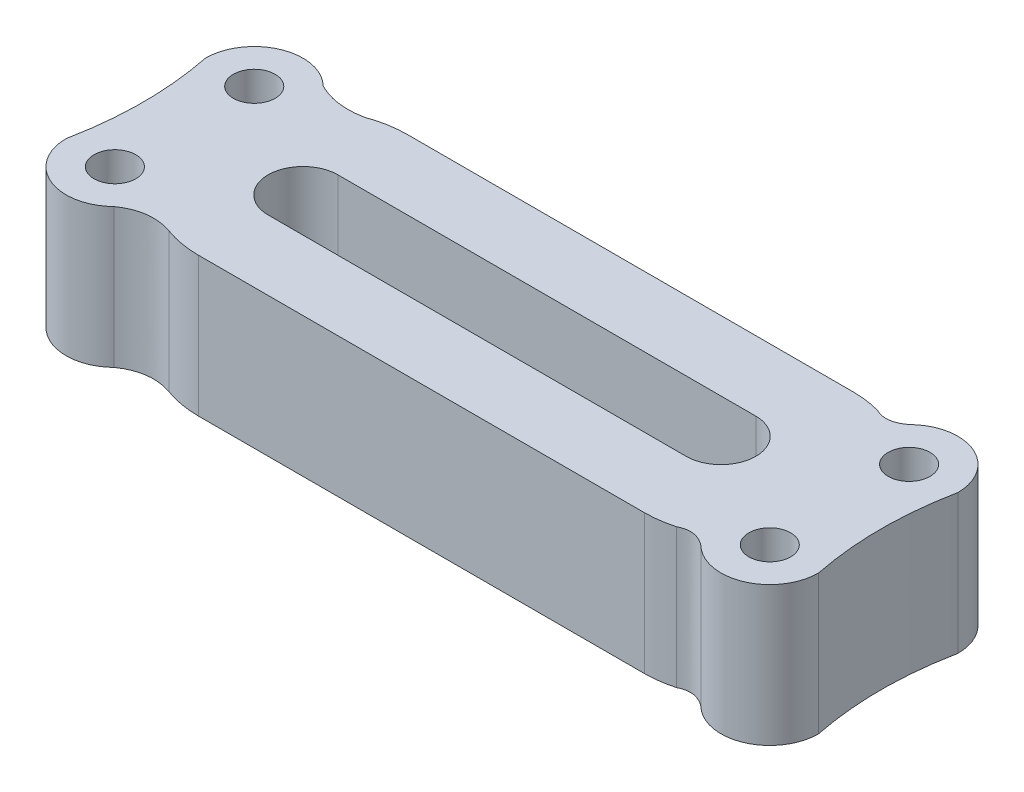
ISO-10303-21;
HEADER;
FILE_DESCRIPTION(('STEP AP214'),'2;1');
FILE_NAME('part.step','',(''),(''),'','','');
FILE_SCHEMA(('AUTOMOTIVE_DESIGN { 1 0 10303 214 1 1 1 1 }'));
ENDSEC;
DATA;
#1=APPLICATION_CONTEXT('core data for automotive mechanical design processes');
#2=APPLICATION_PROTOCOL_DEFINITION('international standard','automotive_design',2000,#1);
#3=PRODUCT_CONTEXT('',#1,'mechanical');
#4=PRODUCT('Part','Part','',(#3));
#5=PRODUCT_RELATED_PRODUCT_CATEGORY('part','',(#4));
#6=PRODUCT_DEFINITION_FORMATION('','',#4);
#7=PRODUCT_DEFINITION_CONTEXT('part definition',#1,'design');
#8=PRODUCT_DEFINITION('design','',#6,#7);
#9=PRODUCT_DEFINITION_SHAPE('','',#8);
#10=(LENGTH_UNIT() NAMED_UNIT(*) SI_UNIT(.MILLI.,.METRE.));
#11=(NAMED_UNIT(*) PLANE_ANGLE_UNIT() SI_UNIT($,.RADIAN.));
#12=(NAMED_UNIT(*) SI_UNIT($,.STERADIAN.) SOLID_ANGLE_UNIT());
#13=UNCERTAINTY_MEASURE_WITH_UNIT(LENGTH_MEASURE(1.E-05),#10,'distance_accuracy_value','');
#14=(GEOMETRIC_REPRESENTATION_CONTEXT(3) GLOBAL_UNCERTAINTY_ASSIGNED_CONTEXT((#13)) GLOBAL_UNIT_ASSIGNED_CONTEXT((#10,
#11,#12)) REPRESENTATION_CONTEXT('',''));
#15=CARTESIAN_POINT('',(0.,0.,0.));
#16=DIRECTION('',(0.,0.,1.));
#17=DIRECTION('',(1.,0.,0.));
#18=AXIS2_PLACEMENT_3D('',#15,#16,#17);
#19=CARTESIAN_POINT('',(-15.,10.,-2.5));
#20=DIRECTION('',(0.,1.,0.));
#21=DIRECTION('',(0.,0.,1.));
#22=AXIS2_PLACEMENT_3D('',#19,#20,#21);
#23=PLANE('',#22);
#24=CARTESIAN_POINT('',(23.5,10.,-7.5));
#25=DIRECTION('',(0.,1.,0.));
#26=DIRECTION('',(0.,0.,1.));
#27=AXIS2_PLACEMENT_3D('',#24,#25,#26);
#28=CIRCLE('',#27,1.5);
#29=CARTESIAN_POINT('',(23.5,10.,-6.));
#30=VERTEX_POINT('',#29);
#31=EDGE_CURVE('E870',#30,#30,#28,.T.);
#32=ORIENTED_EDGE('',*,*,#31,.F.);
#33=EDGE_LOOP('',(#32));
#34=FACE_BOUND('',#33,.T.);
#35=CARTESIAN_POINT('',(-23.5,10.,2.5));
#36=DIRECTION('',(0.,1.,0.));
#37=DIRECTION('',(0.,0.,1.));
#38=AXIS2_PLACEMENT_3D('',#35,#36,#37);
#39=CIRCLE('',#38,1.5);
#40=CARTESIAN_POINT('',(-23.5,10.,4.));
#41=VERTEX_POINT('',#40);
#42=EDGE_CURVE('E222',#41,#41,#39,.T.);
#43=ORIENTED_EDGE('',*,*,#42,.F.);
#44=EDGE_LOOP('',(#43));
#45=FACE_BOUND('',#44,.T.);
#46=CARTESIAN_POINT('',(-15.,10.,-2.5));
#47=DIRECTION('',(0.,1.,0.));
#48=DIRECTION('',(0.,0.,1.));
#49=AXIS2_PLACEMENT_3D('',#46,#47,#48);
#50=CIRCLE('',#49,7.5);
#51=CARTESIAN_POINT('',(-17.5874091079145,10.,4.53955354467036));
#52=VERTEX_POINT('',#51);
#53=CARTESIAN_POINT('',(-15.,10.,5.));
#54=VERTEX_POINT('',#53);
#55=EDGE_CURVE('E238',#52,#54,#50,.T.);
#56=ORIENTED_EDGE('',*,*,#55,.T.);
#57=DIRECTION('',(1.,0.,0.));
#58=VECTOR('',#57,1.);
#59=CARTESIAN_POINT('',(-15.,10.,5.));
#60=LINE('',#59,#58);
#61=CARTESIAN_POINT('',(17.,10.,5.));
#62=VERTEX_POINT('',#61);
#63=EDGE_CURVE('E242',#54,#62,#60,.T.);
#64=ORIENTED_EDGE('',*,*,#63,.T.);
#65=CARTESIAN_POINT('',(17.,10.,-2.5));
#66=DIRECTION('',(0.,1.,0.));
#67=DIRECTION('',(0.,0.,-1.));
#68=AXIS2_PLACEMENT_3D('',#65,#66,#67);
#69=CIRCLE('',#68,7.5);
#70=CARTESIAN_POINT('',(19.0308614368456,10.,4.7198062179212));
#71=VERTEX_POINT('',#70);
#72=EDGE_CURVE('E246',#62,#71,#69,.T.);
#73=ORIENTED_EDGE('',*,*,#72,.T.);
#74=CARTESIAN_POINT('',(19.0308614368456,10.,4.7198062179212));
#75=CARTESIAN_POINT('',(20.0349832779337,10.,4.21106423664924));
#76=CARTESIAN_POINT('',(21.0505102572168,10.,4.99999999999999));
#77=B_SPLINE_CURVE_WITH_KNOTS('',2,(#74,#75,#76),.UNSPECIFIED.,.F.,.F.,(3,3),(0.,1.),.UNSPECIFIED.);
#78=CARTESIAN_POINT('',(21.0505102572168,10.,4.99999999999999));
#79=VERTEX_POINT('',#78);
#80=EDGE_CURVE('E249',#71,#79,#77,.T.);
#81=ORIENTED_EDGE('',*,*,#80,.T.);
#82=CARTESIAN_POINT('',(23.5,10.,2.5));
#83=DIRECTION('',(0.,1.,0.));
#84=DIRECTION('',(0.,0.,1.));
#85=AXIS2_PLACEMENT_3D('',#82,#83,#84);
#86=CIRCLE('',#85,3.5);
#87=CARTESIAN_POINT('',(27.,10.,2.5));
#88=VERTEX_POINT('',#87);
#89=EDGE_CURVE('E255',#79,#88,#86,.T.);
#90=ORIENTED_EDGE('',*,*,#89,.T.);
#91=CARTESIAN_POINT('',(27.,10.,2.5));
#92=CARTESIAN_POINT('',(26.,10.,-2.5));
#93=CARTESIAN_POINT('',(27.,10.,-7.5));
#94=B_SPLINE_CURVE_WITH_KNOTS('',2,(#91,#92,#93),.UNSPECIFIED.,.F.,.F.,(3,3),(0.,1.),.UNSPECIFIED.);
#95=CARTESIAN_POINT('',(27.,10.,-7.5));
#96=VERTEX_POINT('',#95);
#97=EDGE_CURVE('E462',#88,#96,#94,.T.);
#98=ORIENTED_EDGE('',*,*,#97,.T.);
#99=CARTESIAN_POINT('',(23.5,10.,-7.5));
#100=DIRECTION('',(0.,1.,0.));
#101=DIRECTION('',(0.,0.,1.));
#102=AXIS2_PLACEMENT_3D('',#99,#100,#101);
#103=CIRCLE('',#102,3.5);
#104=CARTESIAN_POINT('',(21.0505102572168,10.,-10.));
#105=VERTEX_POINT('',#104);
#106=EDGE_CURVE('E464',#96,#105,#103,.T.);
#107=ORIENTED_EDGE('',*,*,#106,.T.);
#108=CARTESIAN_POINT('',(21.0505102572168,10.,-10.));
#109=CARTESIAN_POINT('',(20.0349832779337,10.,-9.21106423664925));
#110=CARTESIAN_POINT('',(19.0308614368456,10.,-9.71980621792119));
#111=B_SPLINE_CURVE_WITH_KNOTS('',2,(#108,#109,#110),.UNSPECIFIED.,.F.,.F.,(3,3),(0.,1.),.UNSPECIFIED.);
#112=CARTESIAN_POINT('',(19.0308614368456,10.,-9.71980621792119));
#113=VERTEX_POINT('',#112);
#114=EDGE_CURVE('E467',#105,#113,#111,.T.);
#115=ORIENTED_EDGE('',*,*,#114,.T.);
#116=CARTESIAN_POINT('',(17.,10.,-2.5));
#117=DIRECTION('',(0.,1.,0.));
#118=DIRECTION('',(0.,0.,-1.));
#119=AXIS2_PLACEMENT_3D('',#116,#117,#118);
#120=CIRCLE('',#119,7.5);
#121=CARTESIAN_POINT('',(17.,10.,-9.99999999999999));
#122=VERTEX_POINT('',#121);
#123=EDGE_CURVE('E495',#113,#122,#120,.T.);
#124=ORIENTED_EDGE('',*,*,#123,.T.);
#125=DIRECTION('',(-1.,0.,0.));
#126=VECTOR('',#125,1.);
#127=CARTESIAN_POINT('',(-15.,10.,-9.99999999999999));
#128=LINE('',#127,#126);
#129=CARTESIAN_POINT('',(-15.,10.,-9.99999999999999));
#130=VERTEX_POINT('',#129);
#131=EDGE_CURVE('E501',#122,#130,#128,.T.);
#132=ORIENTED_EDGE('',*,*,#131,.T.);
#133=CARTESIAN_POINT('',(-15.,10.,-2.5));
#134=DIRECTION('',(0.,1.,0.));
#135=DIRECTION('',(0.,0.,1.));
#136=AXIS2_PLACEMENT_3D('',#133,#134,#135);
#137=CIRCLE('',#136,7.5);
#138=CARTESIAN_POINT('',(-17.5874091079145,10.,-9.53955354467035));
#139=VERTEX_POINT('',#138);
#140=EDGE_CURVE('E504',#130,#139,#137,.T.);
#141=ORIENTED_EDGE('',*,*,#140,.T.);
#142=CARTESIAN_POINT('',(-17.5874091079145,10.,-9.53955354467035));
#143=CARTESIAN_POINT('',(-19.4284579155136,10.,-9.15641368122657));
#144=CARTESIAN_POINT('',(-21.0505102572168,10.,-10.));
#145=B_SPLINE_CURVE_WITH_KNOTS('',2,(#142,#143,#144),.UNSPECIFIED.,.F.,.F.,(3,3),(0.,1.),.UNSPECIFIED.);
#146=CARTESIAN_POINT('',(-21.0505102572168,10.,-10.));
#147=VERTEX_POINT('',#146);
#148=EDGE_CURVE('E507',#139,#147,#145,.T.);
#149=ORIENTED_EDGE('',*,*,#148,.T.);
#150=CARTESIAN_POINT('',(-23.5,10.,-7.5));
#151=DIRECTION('',(0.,1.,0.));
#152=DIRECTION('',(0.,0.,1.));
#153=AXIS2_PLACEMENT_3D('',#150,#151,#152);
#154=CIRCLE('',#153,3.5);
#155=CARTESIAN_POINT('',(-27.,10.,-7.5));
#156=VERTEX_POINT('',#155);
#157=EDGE_CURVE('E513',#147,#156,#154,.T.);
#158=ORIENTED_EDGE('',*,*,#157,.T.);
#159=CARTESIAN_POINT('',(-27.,10.,-7.5));
#160=CARTESIAN_POINT('',(-26.,10.,-2.5));
#161=CARTESIAN_POINT('',(-27.,10.,2.5));
#162=B_SPLINE_CURVE_WITH_KNOTS('',2,(#159,#160,#161),.UNSPECIFIED.,.F.,.F.,(3,3),(0.,1.),.UNSPECIFIED.);
#163=CARTESIAN_POINT('',(-27.,10.,2.5));
#164=VERTEX_POINT('',#163);
#165=EDGE_CURVE('E552',#156,#164,#162,.T.);
#166=ORIENTED_EDGE('',*,*,#165,.T.);
#167=CARTESIAN_POINT('',(-23.5,10.,2.5));
#168=DIRECTION('',(0.,1.,0.));
#169=DIRECTION('',(0.,0.,1.));
#170=AXIS2_PLACEMENT_3D('',#167,#168,#169);
#171=CIRCLE('',#170,3.5);
#172=CARTESIAN_POINT('',(-21.0505102572168,10.,5.));
#173=VERTEX_POINT('',#172);
#174=EDGE_CURVE('E307',#164,#173,#171,.T.);
#175=ORIENTED_EDGE('',*,*,#174,.T.);
#176=CARTESIAN_POINT('',(-21.0505102572168,10.,5.));
#177=CARTESIAN_POINT('',(-19.4864809640116,10.,3.90383801335037));
#178=CARTESIAN_POINT('',(-17.5874091079145,10.,4.53955354467036));
#179=B_SPLINE_CURVE_WITH_KNOTS('',2,(#176,#177,#178),.UNSPECIFIED.,.F.,.F.,(3,3),(0.,1.),.UNSPECIFIED.);
#180=EDGE_CURVE('E299',#173,#52,#179,.T.);
#181=ORIENTED_EDGE('',*,*,#180,.T.);
#182=EDGE_LOOP('',(#56,#64,#73,#81,#90,#98,#107,#115,#124,#132,#141,#149,#158,#166,#175,#181));
#183=FACE_BOUND('',#182,.T.);
#184=DIRECTION('',(-1.,0.,0.));
#185=VECTOR('',#184,1.);
#186=CARTESIAN_POINT('',(-15.,10.,-4.99999999999999));
#187=LINE('',#186,#185);
#188=CARTESIAN_POINT('',(15.,10.,-4.99999999999999));
#189=VERTEX_POINT('',#188);
#190=CARTESIAN_POINT('',(-15.,10.,-4.99999999999999));
#191=VERTEX_POINT('',#190);
#192=EDGE_CURVE('E196',#189,#191,#187,.T.);
#193=ORIENTED_EDGE('',*,*,#192,.F.);
#194=CARTESIAN_POINT('',(15.,10.,-2.5));
#195=DIRECTION('',(0.,1.,0.));
#196=DIRECTION('',(0.,0.,-1.));
#197=AXIS2_PLACEMENT_3D('',#194,#195,#196);
#198=CIRCLE('',#197,2.5);
#199=CARTESIAN_POINT('',(15.,10.,0.));
#200=VERTEX_POINT('',#199);
#201=EDGE_CURVE('E187',#200,#189,#198,.T.);
#202=ORIENTED_EDGE('',*,*,#201,.F.);
#203=DIRECTION('',(1.,0.,0.));
#204=VECTOR('',#203,1.);
#205=CARTESIAN_POINT('',(-15.,10.,0.));
#206=LINE('',#205,#204);
#207=CARTESIAN_POINT('',(-15.,10.,0.));
#208=VERTEX_POINT('',#207);
#209=EDGE_CURVE('E214',#208,#200,#206,.T.);
#210=ORIENTED_EDGE('',*,*,#209,.F.);
#211=CARTESIAN_POINT('',(-15.,10.,-2.5));
#212=DIRECTION('',(0.,1.,0.));
#213=DIRECTION('',(0.,0.,1.));
#214=AXIS2_PLACEMENT_3D('',#211,#212,#213);
#215=CIRCLE('',#214,2.5);
#216=EDGE_CURVE('E210',#191,#208,#215,.T.);
#217=ORIENTED_EDGE('',*,*,#216,.F.);
#218=EDGE_LOOP('',(#193,#202,#210,#217));
#219=FACE_BOUND('',#218,.T.);
#220=CARTESIAN_POINT('',(-23.5,10.,-7.5));
#221=DIRECTION('',(0.,1.,0.));
#222=DIRECTION('',(0.,0.,1.));
#223=AXIS2_PLACEMENT_3D('',#220,#221,#222);
#224=CIRCLE('',#223,1.5);
#225=CARTESIAN_POINT('',(-23.5,10.,-6.));
#226=VERTEX_POINT('',#225);
#227=EDGE_CURVE('E878',#226,#226,#224,.T.);
#228=ORIENTED_EDGE('',*,*,#227,.F.);
#229=EDGE_LOOP('',(#228));
#230=FACE_BOUND('',#229,.T.);
#231=CARTESIAN_POINT('',(23.5,10.,2.5));
#232=DIRECTION('',(0.,1.,0.));
#233=DIRECTION('',(0.,0.,1.));
#234=AXIS2_PLACEMENT_3D('',#231,#232,#233);
#235=CIRCLE('',#234,1.5);
#236=CARTESIAN_POINT('',(23.5,10.,4.));
#237=VERTEX_POINT('',#236);
#238=EDGE_CURVE('E859',#237,#237,#235,.T.);
#239=ORIENTED_EDGE('',*,*,#238,.F.);
#240=EDGE_LOOP('',(#239));
#241=FACE_BOUND('',#240,.T.);
#242=ADVANCED_FACE('F49',(#34,#45,#183,#219,#230,#241),#23,.T.);
#243=CARTESIAN_POINT('',(-15.,0.,-2.5));
#244=DIRECTION('',(0.,1.,0.));
#245=DIRECTION('',(0.,0.,1.));
#246=AXIS2_PLACEMENT_3D('',#243,#244,#245);
#247=PLANE('',#246);
#248=CARTESIAN_POINT('',(-15.,0.,-2.5));
#249=DIRECTION('',(0.,1.,0.));
#250=DIRECTION('',(0.,0.,1.));
#251=AXIS2_PLACEMENT_3D('',#248,#249,#250);
#252=CIRCLE('',#251,7.5);
#253=CARTESIAN_POINT('',(-17.5874091079145,0.,4.53955354467036));
#254=VERTEX_POINT('',#253);
#255=CARTESIAN_POINT('',(-15.,0.,5.));
#256=VERTEX_POINT('',#255);
#257=EDGE_CURVE('E205',#254,#256,#252,.T.);
#258=ORIENTED_EDGE('',*,*,#257,.F.);
#259=CARTESIAN_POINT('',(-21.0505102572168,0.,5.));
#260=CARTESIAN_POINT('',(-19.4864809640116,0.,3.90383801335037));
#261=CARTESIAN_POINT('',(-17.5874091079145,0.,4.53955354467036));
#262=B_SPLINE_CURVE_WITH_KNOTS('',2,(#259,#260,#261),.UNSPECIFIED.,.F.,.F.,(3,3),(0.,1.),.UNSPECIFIED.);
#263=CARTESIAN_POINT('',(-21.0505102572168,0.,5.));
#264=VERTEX_POINT('',#263);
#265=EDGE_CURVE('E243',#264,#254,#262,.T.);
#266=ORIENTED_EDGE('',*,*,#265,.F.);
#267=CARTESIAN_POINT('',(-23.5,0.,2.5));
#268=DIRECTION('',(0.,1.,0.));
#269=DIRECTION('',(0.,0.,1.));
#270=AXIS2_PLACEMENT_3D('',#267,#268,#269);
#271=CIRCLE('',#270,3.5);
#272=CARTESIAN_POINT('',(-27.,0.,2.5));
#273=VERTEX_POINT('',#272);
#274=EDGE_CURVE('E376',#273,#264,#271,.T.);
#275=ORIENTED_EDGE('',*,*,#274,.F.);
#276=CARTESIAN_POINT('',(-27.,0.,-7.5));
#277=CARTESIAN_POINT('',(-26.,0.,-2.5));
#278=CARTESIAN_POINT('',(-27.,0.,2.5));
#279=B_SPLINE_CURVE_WITH_KNOTS('',2,(#276,#277,#278),.UNSPECIFIED.,.F.,.F.,(3,3),(0.,1.),.UNSPECIFIED.);
#280=CARTESIAN_POINT('',(-27.,0.,-7.5));
#281=VERTEX_POINT('',#280);
#282=EDGE_CURVE('E371',#281,#273,#279,.T.);
#283=ORIENTED_EDGE('',*,*,#282,.F.);
#284=CARTESIAN_POINT('',(-23.5,0.,-7.5));
#285=DIRECTION('',(0.,1.,0.));
#286=DIRECTION('',(0.,0.,1.));
#287=AXIS2_PLACEMENT_3D('',#284,#285,#286);
#288=CIRCLE('',#287,3.5);
#289=CARTESIAN_POINT('',(-21.0505102572168,0.,-10.));
#290=VERTEX_POINT('',#289);
#291=EDGE_CURVE('E365',#290,#281,#288,.T.);
#292=ORIENTED_EDGE('',*,*,#291,.F.);
#293=CARTESIAN_POINT('',(-17.5874091079145,0.,-9.53955354467035));
#294=CARTESIAN_POINT('',(-19.4284579155136,0.,-9.15641368122657));
#295=CARTESIAN_POINT('',(-21.0505102572168,0.,-10.));
#296=B_SPLINE_CURVE_WITH_KNOTS('',2,(#293,#294,#295),.UNSPECIFIED.,.F.,.F.,(3,3),(0.,1.),.UNSPECIFIED.);
#297=CARTESIAN_POINT('',(-17.5874091079145,0.,-9.53955354467035));
#298=VERTEX_POINT('',#297);
#299=EDGE_CURVE('E360',#298,#290,#296,.T.);
#300=ORIENTED_EDGE('',*,*,#299,.F.);
#301=CARTESIAN_POINT('',(-15.,0.,-2.5));
#302=DIRECTION('',(0.,1.,0.));
#303=DIRECTION('',(0.,0.,1.));
#304=AXIS2_PLACEMENT_3D('',#301,#302,#303);
#305=CIRCLE('',#304,7.5);
#306=CARTESIAN_POINT('',(-15.,0.,-9.99999999999999));
#307=VERTEX_POINT('',#306);
#308=EDGE_CURVE('E357',#307,#298,#305,.T.);
#309=ORIENTED_EDGE('',*,*,#308,.F.);
#310=DIRECTION('',(-1.,0.,0.));
#311=VECTOR('',#310,1.);
#312=CARTESIAN_POINT('',(-15.,0.,-9.99999999999999));
#313=LINE('',#312,#311);
#314=CARTESIAN_POINT('',(17.,0.,-9.99999999999999));
#315=VERTEX_POINT('',#314);
#316=EDGE_CURVE('E354',#315,#307,#313,.T.);
#317=ORIENTED_EDGE('',*,*,#316,.F.);
#318=CARTESIAN_POINT('',(17.,0.,-2.5));
#319=DIRECTION('',(0.,1.,0.));
#320=DIRECTION('',(0.,0.,-1.));
#321=AXIS2_PLACEMENT_3D('',#318,#319,#320);
#322=CIRCLE('',#321,7.5);
#323=CARTESIAN_POINT('',(19.0308614368456,0.,-9.71980621792119));
#324=VERTEX_POINT('',#323);
#325=EDGE_CURVE('E348',#324,#315,#322,.T.);
#326=ORIENTED_EDGE('',*,*,#325,.F.);
#327=CARTESIAN_POINT('',(21.0505102572168,0.,-10.));
#328=CARTESIAN_POINT('',(20.0349832779337,0.,-9.21106423664925));
#329=CARTESIAN_POINT('',(19.0308614368456,0.,-9.71980621792119));
#330=B_SPLINE_CURVE_WITH_KNOTS('',2,(#327,#328,#329),.UNSPECIFIED.,.F.,.F.,(3,3),(0.,1.),.UNSPECIFIED.);
#331=CARTESIAN_POINT('',(21.0505102572168,0.,-10.));
#332=VERTEX_POINT('',#331);
#333=EDGE_CURVE('E343',#332,#324,#330,.T.);
#334=ORIENTED_EDGE('',*,*,#333,.F.);
#335=CARTESIAN_POINT('',(23.5,0.,-7.5));
#336=DIRECTION('',(0.,1.,0.));
#337=DIRECTION('',(0.,0.,1.));
#338=AXIS2_PLACEMENT_3D('',#335,#336,#337);
#339=CIRCLE('',#338,3.5);
#340=CARTESIAN_POINT('',(27.,0.,-7.5));
#341=VERTEX_POINT('',#340);
#342=EDGE_CURVE('E337',#341,#332,#339,.T.);
#343=ORIENTED_EDGE('',*,*,#342,.F.);
#344=CARTESIAN_POINT('',(27.,0.,2.5));
#345=CARTESIAN_POINT('',(26.,0.,-2.5));
#346=CARTESIAN_POINT('',(27.,0.,-7.5));
#347=B_SPLINE_CURVE_WITH_KNOTS('',2,(#344,#345,#346),.UNSPECIFIED.,.F.,.F.,(3,3),(0.,1.),.UNSPECIFIED.);
#348=CARTESIAN_POINT('',(27.,0.,2.5));
#349=VERTEX_POINT('',#348);
#350=EDGE_CURVE('E332',#349,#341,#347,.T.);
#351=ORIENTED_EDGE('',*,*,#350,.F.);
#352=CARTESIAN_POINT('',(23.5,0.,2.5));
#353=DIRECTION('',(0.,1.,0.));
#354=DIRECTION('',(0.,0.,1.));
#355=AXIS2_PLACEMENT_3D('',#352,#353,#354);
#356=CIRCLE('',#355,3.5);
#357=CARTESIAN_POINT('',(21.0505102572168,0.,4.99999999999999));
#358=VERTEX_POINT('',#357);
#359=EDGE_CURVE('E326',#358,#349,#356,.T.);
#360=ORIENTED_EDGE('',*,*,#359,.F.);
#361=CARTESIAN_POINT('',(19.0308614368456,0.,4.7198062179212));
#362=CARTESIAN_POINT('',(20.0349832779337,0.,4.21106423664924));
#363=CARTESIAN_POINT('',(21.0505102572168,0.,4.99999999999999));
#364=B_SPLINE_CURVE_WITH_KNOTS('',2,(#361,#362,#363),.UNSPECIFIED.,.F.,.F.,(3,3),(0.,1.),.UNSPECIFIED.);
#365=CARTESIAN_POINT('',(19.0308614368456,0.,4.7198062179212));
#366=VERTEX_POINT('',#365);
#367=EDGE_CURVE('E321',#366,#358,#364,.T.);
#368=ORIENTED_EDGE('',*,*,#367,.F.);
#369=CARTESIAN_POINT('',(17.,0.,-2.5));
#370=DIRECTION('',(0.,1.,0.));
#371=DIRECTION('',(0.,0.,-1.));
#372=AXIS2_PLACEMENT_3D('',#369,#370,#371);
#373=CIRCLE('',#372,7.5);
#374=CARTESIAN_POINT('',(17.,0.,5.));
#375=VERTEX_POINT('',#374);
#376=EDGE_CURVE('E318',#375,#366,#373,.T.);
#377=ORIENTED_EDGE('',*,*,#376,.F.);
#378=DIRECTION('',(1.,0.,0.));
#379=VECTOR('',#378,1.);
#380=CARTESIAN_POINT('',(-15.,0.,5.));
#381=LINE('',#380,#379);
#382=EDGE_CURVE('E315',#256,#375,#381,.T.);
#383=ORIENTED_EDGE('',*,*,#382,.F.);
#384=EDGE_LOOP('',(#258,#266,#275,#283,#292,#300,#309,#317,#326,#334,#343,#351,#360,#368,#377,#383));
#385=FACE_BOUND('',#384,.T.);
#386=CARTESIAN_POINT('',(15.,0.,-2.5));
#387=DIRECTION('',(0.,1.,0.));
#388=DIRECTION('',(0.,0.,-1.));
#389=AXIS2_PLACEMENT_3D('',#386,#387,#388);
#390=CIRCLE('',#389,2.5);
#391=CARTESIAN_POINT('',(15.,0.,0.));
#392=VERTEX_POINT('',#391);
#393=CARTESIAN_POINT('',(15.,0.,-4.99999999999999));
#394=VERTEX_POINT('',#393);
#395=EDGE_CURVE('E73',#392,#394,#390,.T.);
#396=ORIENTED_EDGE('',*,*,#395,.T.);
#397=DIRECTION('',(-1.,0.,0.));
#398=VECTOR('',#397,1.);
#399=CARTESIAN_POINT('',(-15.,0.,-4.99999999999999));
#400=LINE('',#399,#398);
#401=CARTESIAN_POINT('',(-15.,0.,-4.99999999999999));
#402=VERTEX_POINT('',#401);
#403=EDGE_CURVE('E203',#394,#402,#400,.T.);
#404=ORIENTED_EDGE('',*,*,#403,.T.);
#405=CARTESIAN_POINT('',(-15.,0.,-2.5));
#406=DIRECTION('',(0.,1.,0.));
#407=DIRECTION('',(0.,0.,1.));
#408=AXIS2_PLACEMENT_3D('',#405,#406,#407);
#409=CIRCLE('',#408,2.5);
#410=CARTESIAN_POINT('',(-15.,0.,0.));
#411=VERTEX_POINT('',#410);
#412=EDGE_CURVE('E225',#402,#411,#409,.T.);
#413=ORIENTED_EDGE('',*,*,#412,.T.);
#414=DIRECTION('',(1.,0.,0.));
#415=VECTOR('',#414,1.);
#416=CARTESIAN_POINT('',(-15.,0.,0.));
#417=LINE('',#416,#415);
#418=EDGE_CURVE('E197',#411,#392,#417,.T.);
#419=ORIENTED_EDGE('',*,*,#418,.T.);
#420=EDGE_LOOP('',(#396,#404,#413,#419));
#421=FACE_BOUND('',#420,.T.);
#422=CARTESIAN_POINT('',(-23.5,0.,2.5));
#423=DIRECTION('',(0.,1.,0.));
#424=DIRECTION('',(0.,0.,1.));
#425=AXIS2_PLACEMENT_3D('',#422,#423,#424);
#426=CIRCLE('',#425,1.5);
#427=CARTESIAN_POINT('',(-23.5,0.,4.));
#428=VERTEX_POINT('',#427);
#429=EDGE_CURVE('E882',#428,#428,#426,.T.);
#430=ORIENTED_EDGE('',*,*,#429,.T.);
#431=EDGE_LOOP('',(#430));
#432=FACE_BOUND('',#431,.T.);
#433=CARTESIAN_POINT('',(-23.5,0.,-7.5));
#434=DIRECTION('',(0.,1.,0.));
#435=DIRECTION('',(0.,0.,1.));
#436=AXIS2_PLACEMENT_3D('',#433,#434,#435);
#437=CIRCLE('',#436,1.5);
#438=CARTESIAN_POINT('',(-23.5,0.,-6.));
#439=VERTEX_POINT('',#438);
#440=EDGE_CURVE('E874',#439,#439,#437,.T.);
#441=ORIENTED_EDGE('',*,*,#440,.T.);
#442=EDGE_LOOP('',(#441));
#443=FACE_BOUND('',#442,.T.);
#444=CARTESIAN_POINT('',(23.5,0.,-7.5));
#445=DIRECTION('',(0.,1.,0.));
#446=DIRECTION('',(0.,0.,1.));
#447=AXIS2_PLACEMENT_3D('',#444,#445,#446);
#448=CIRCLE('',#447,1.5);
#449=CARTESIAN_POINT('',(23.5,0.,-6.));
#450=VERTEX_POINT('',#449);
#451=EDGE_CURVE('E867',#450,#450,#448,.T.);
#452=ORIENTED_EDGE('',*,*,#451,.T.);
#453=EDGE_LOOP('',(#452));
#454=FACE_BOUND('',#453,.T.);
#455=CARTESIAN_POINT('',(23.5,0.,2.5));
#456=DIRECTION('',(0.,1.,0.));
#457=DIRECTION('',(0.,0.,1.));
#458=AXIS2_PLACEMENT_3D('',#455,#456,#457);
#459=CIRCLE('',#458,1.5);
#460=CARTESIAN_POINT('',(23.5,0.,4.));
#461=VERTEX_POINT('',#460);
#462=EDGE_CURVE('E862',#461,#461,#459,.T.);
#463=ORIENTED_EDGE('',*,*,#462,.T.);
#464=EDGE_LOOP('',(#463));
#465=FACE_BOUND('',#464,.T.);
#466=ADVANCED_FACE('F277',(#385,#421,#432,#443,#454,#465),#247,.F.);
#467=CARTESIAN_POINT('',(-15.,10.,-2.5));
#468=DIRECTION('',(0.,-1.,0.));
#469=DIRECTION('',(0.,0.,-1.));
#470=AXIS2_PLACEMENT_3D('',#467,#468,#469);
#471=CYLINDRICAL_SURFACE('',#470,7.5);
#472=ORIENTED_EDGE('',*,*,#257,.T.);
#473=DIRECTION('',(0.,-1.,0.));
#474=VECTOR('',#473,1.);
#475=CARTESIAN_POINT('',(-15.,10.,5.));
#476=LINE('',#475,#474);
#477=EDGE_CURVE('E11',#54,#256,#476,.T.);
#478=ORIENTED_EDGE('',*,*,#477,.F.);
#479=ORIENTED_EDGE('',*,*,#55,.F.);
#480=DIRECTION('',(0.,-1.,0.));
#481=VECTOR('',#480,1.);
#482=CARTESIAN_POINT('',(-17.5874091079145,10.,4.53955354467036));
#483=LINE('',#482,#481);
#484=EDGE_CURVE('E306',#52,#254,#483,.T.);
#485=ORIENTED_EDGE('',*,*,#484,.T.);
#486=EDGE_LOOP('',(#472,#478,#479,#485));
#487=FACE_BOUND('',#486,.T.);
#488=ADVANCED_FACE('F51',(#487),#471,.T.);
#489=CARTESIAN_POINT('',(-15.,10.,5.));
#490=DIRECTION('',(0.,0.,-1.));
#491=DIRECTION('',(-1.,0.,0.));
#492=AXIS2_PLACEMENT_3D('',#489,#490,#491);
#493=PLANE('',#492);
#494=ORIENTED_EDGE('',*,*,#382,.T.);
#495=DIRECTION('',(0.,-1.,0.));
#496=VECTOR('',#495,1.);
#497=CARTESIAN_POINT('',(17.,10.,5.));
#498=LINE('',#497,#496);
#499=EDGE_CURVE('E58',#62,#375,#498,.T.);
#500=ORIENTED_EDGE('',*,*,#499,.F.);
#501=ORIENTED_EDGE('',*,*,#63,.F.);
#502=ORIENTED_EDGE('',*,*,#477,.T.);
#503=EDGE_LOOP('',(#494,#500,#501,#502));
#504=FACE_BOUND('',#503,.T.);
#505=ADVANCED_FACE('F270',(#504),#493,.F.);
#506=CARTESIAN_POINT('',(17.,10.,-2.5));
#507=DIRECTION('',(0.,-1.,0.));
#508=DIRECTION('',(0.,0.,-1.));
#509=AXIS2_PLACEMENT_3D('',#506,#507,#508);
#510=CYLINDRICAL_SURFACE('',#509,7.5);
#511=ORIENTED_EDGE('',*,*,#376,.T.);
#512=DIRECTION('',(0.,-1.,0.));
#513=VECTOR('',#512,1.);
#514=CARTESIAN_POINT('',(19.0308614368456,10.,4.7198062179212));
#515=LINE('',#514,#513);
#516=EDGE_CURVE('E440',#71,#366,#515,.T.);
#517=ORIENTED_EDGE('',*,*,#516,.F.);
#518=ORIENTED_EDGE('',*,*,#72,.F.);
#519=ORIENTED_EDGE('',*,*,#499,.T.);
#520=EDGE_LOOP('',(#511,#517,#518,#519));
#521=FACE_BOUND('',#520,.T.);
#522=ADVANCED_FACE('F266',(#521),#510,.T.);
#523=DIRECTION('',(0.,-1.,0.));
#524=VECTOR('',#523,1.);
#525=SURFACE_OF_LINEAR_EXTRUSION('',#77,#524);
#526=ORIENTED_EDGE('',*,*,#367,.T.);
#527=DIRECTION('',(0.,-1.,0.));
#528=VECTOR('',#527,1.);
#529=CARTESIAN_POINT('',(21.0505102572168,10.,4.99999999999999));
#530=LINE('',#529,#528);
#531=EDGE_CURVE('E436',#79,#358,#530,.T.);
#532=ORIENTED_EDGE('',*,*,#531,.F.);
#533=ORIENTED_EDGE('',*,*,#80,.F.);
#534=ORIENTED_EDGE('',*,*,#516,.T.);
#535=EDGE_LOOP('',(#526,#532,#533,#534));
#536=FACE_BOUND('',#535,.T.);
#537=ADVANCED_FACE('F261',(#536),#525,.F.);
#538=CARTESIAN_POINT('',(23.5,10.,2.5));
#539=DIRECTION('',(0.,-1.,0.));
#540=DIRECTION('',(0.,0.,-1.));
#541=AXIS2_PLACEMENT_3D('',#538,#539,#540);
#542=CYLINDRICAL_SURFACE('',#541,3.5);
#543=ORIENTED_EDGE('',*,*,#359,.T.);
#544=DIRECTION('',(0.,-1.,0.));
#545=VECTOR('',#544,1.);
#546=CARTESIAN_POINT('',(27.,10.,2.5));
#547=LINE('',#546,#545);
#548=EDGE_CURVE('E432',#88,#349,#547,.T.);
#549=ORIENTED_EDGE('',*,*,#548,.F.);
#550=ORIENTED_EDGE('',*,*,#89,.F.);
#551=ORIENTED_EDGE('',*,*,#531,.T.);
#552=EDGE_LOOP('',(#543,#549,#550,#551));
#553=FACE_BOUND('',#552,.T.);
#554=ADVANCED_FACE('F265',(#553),#542,.T.);
#555=DIRECTION('',(0.,-1.,0.));
#556=VECTOR('',#555,1.);
#557=SURFACE_OF_LINEAR_EXTRUSION('',#94,#556);
#558=ORIENTED_EDGE('',*,*,#350,.T.);
#559=DIRECTION('',(0.,-1.,0.));
#560=VECTOR('',#559,1.);
#561=CARTESIAN_POINT('',(27.,10.,-7.5));
#562=LINE('',#561,#560);
#563=EDGE_CURVE('E428',#96,#341,#562,.T.);
#564=ORIENTED_EDGE('',*,*,#563,.F.);
#565=ORIENTED_EDGE('',*,*,#97,.F.);
#566=ORIENTED_EDGE('',*,*,#548,.T.);
#567=EDGE_LOOP('',(#558,#564,#565,#566));
#568=FACE_BOUND('',#567,.T.);
#569=ADVANCED_FACE('F476',(#568),#557,.F.);
#570=CARTESIAN_POINT('',(23.5,10.,-7.5));
#571=DIRECTION('',(0.,-1.,0.));
#572=DIRECTION('',(0.,0.,-1.));
#573=AXIS2_PLACEMENT_3D('',#570,#571,#572);
#574=CYLINDRICAL_SURFACE('',#573,3.5);
#575=ORIENTED_EDGE('',*,*,#342,.T.);
#576=DIRECTION('',(0.,-1.,0.));
#577=VECTOR('',#576,1.);
#578=CARTESIAN_POINT('',(21.0505102572168,10.,-10.));
#579=LINE('',#578,#577);
#580=EDGE_CURVE('E424',#105,#332,#579,.T.);
#581=ORIENTED_EDGE('',*,*,#580,.F.);
#582=ORIENTED_EDGE('',*,*,#106,.F.);
#583=ORIENTED_EDGE('',*,*,#563,.T.);
#584=EDGE_LOOP('',(#575,#581,#582,#583));
#585=FACE_BOUND('',#584,.T.);
#586=ADVANCED_FACE('F479',(#585),#574,.T.);
#587=DIRECTION('',(0.,-1.,0.));
#588=VECTOR('',#587,1.);
#589=SURFACE_OF_LINEAR_EXTRUSION('',#111,#588);
#590=ORIENTED_EDGE('',*,*,#333,.T.);
#591=DIRECTION('',(0.,-1.,0.));
#592=VECTOR('',#591,1.);
#593=CARTESIAN_POINT('',(19.0308614368456,10.,-9.71980621792119));
#594=LINE('',#593,#592);
#595=EDGE_CURVE('E420',#113,#324,#594,.T.);
#596=ORIENTED_EDGE('',*,*,#595,.F.);
#597=ORIENTED_EDGE('',*,*,#114,.F.);
#598=ORIENTED_EDGE('',*,*,#580,.T.);
#599=EDGE_LOOP('',(#590,#596,#597,#598));
#600=FACE_BOUND('',#599,.T.);
#601=ADVANCED_FACE('F483',(#600),#589,.F.);
#602=CARTESIAN_POINT('',(17.,10.,-2.5));
#603=DIRECTION('',(0.,-1.,0.));
#604=DIRECTION('',(0.,0.,-1.));
#605=AXIS2_PLACEMENT_3D('',#602,#603,#604);
#606=CYLINDRICAL_SURFACE('',#605,7.5);
#607=ORIENTED_EDGE('',*,*,#325,.T.);
#608=DIRECTION('',(0.,-1.,0.));
#609=VECTOR('',#608,1.);
#610=CARTESIAN_POINT('',(17.,10.,-9.99999999999999));
#611=LINE('',#610,#609);
#612=EDGE_CURVE('E416',#122,#315,#611,.T.);
#613=ORIENTED_EDGE('',*,*,#612,.F.);
#614=ORIENTED_EDGE('',*,*,#123,.F.);
#615=ORIENTED_EDGE('',*,*,#595,.T.);
#616=EDGE_LOOP('',(#607,#613,#614,#615));
#617=FACE_BOUND('',#616,.T.);
#618=ADVANCED_FACE('F487',(#617),#606,.T.);
#619=CARTESIAN_POINT('',(-15.,10.,-9.99999999999999));
#620=DIRECTION('',(0.,0.,1.));
#621=DIRECTION('',(1.,0.,0.));
#622=AXIS2_PLACEMENT_3D('',#619,#620,#621);
#623=PLANE('',#622);
#624=ORIENTED_EDGE('',*,*,#316,.T.);
#625=DIRECTION('',(0.,-1.,0.));
#626=VECTOR('',#625,1.);
#627=CARTESIAN_POINT('',(-15.,10.,-9.99999999999999));
#628=LINE('',#627,#626);
#629=EDGE_CURVE('E412',#130,#307,#628,.T.);
#630=ORIENTED_EDGE('',*,*,#629,.F.);
#631=ORIENTED_EDGE('',*,*,#131,.F.);
#632=ORIENTED_EDGE('',*,*,#612,.T.);
#633=EDGE_LOOP('',(#624,#630,#631,#632));
#634=FACE_BOUND('',#633,.T.);
#635=ADVANCED_FACE('F526',(#634),#623,.F.);
#636=CARTESIAN_POINT('',(-15.,10.,-2.5));
#637=DIRECTION('',(0.,-1.,0.));
#638=DIRECTION('',(0.,0.,-1.));
#639=AXIS2_PLACEMENT_3D('',#636,#637,#638);
#640=CYLINDRICAL_SURFACE('',#639,7.5);
#641=ORIENTED_EDGE('',*,*,#308,.T.);
#642=DIRECTION('',(0.,-1.,0.));
#643=VECTOR('',#642,1.);
#644=CARTESIAN_POINT('',(-17.5874091079145,10.,-9.53955354467035));
#645=LINE('',#644,#643);
#646=EDGE_CURVE('E408',#139,#298,#645,.T.);
#647=ORIENTED_EDGE('',*,*,#646,.F.);
#648=ORIENTED_EDGE('',*,*,#140,.F.);
#649=ORIENTED_EDGE('',*,*,#629,.T.);
#650=EDGE_LOOP('',(#641,#647,#648,#649));
#651=FACE_BOUND('',#650,.T.);
#652=ADVANCED_FACE('F523',(#651),#640,.T.);
#653=DIRECTION('',(0.,-1.,0.));
#654=VECTOR('',#653,1.);
#655=SURFACE_OF_LINEAR_EXTRUSION('',#145,#654);
#656=ORIENTED_EDGE('',*,*,#299,.T.);
#657=DIRECTION('',(0.,-1.,0.));
#658=VECTOR('',#657,1.);
#659=CARTESIAN_POINT('',(-21.0505102572168,10.,-10.));
#660=LINE('',#659,#658);
#661=EDGE_CURVE('E404',#147,#290,#660,.T.);
#662=ORIENTED_EDGE('',*,*,#661,.F.);
#663=ORIENTED_EDGE('',*,*,#148,.F.);
#664=ORIENTED_EDGE('',*,*,#646,.T.);
#665=EDGE_LOOP('',(#656,#662,#663,#664));
#666=FACE_BOUND('',#665,.T.);
#667=ADVANCED_FACE('F518',(#666),#655,.F.);
#668=CARTESIAN_POINT('',(-23.5,10.,-7.5));
#669=DIRECTION('',(0.,-1.,0.));
#670=DIRECTION('',(0.,0.,-1.));
#671=AXIS2_PLACEMENT_3D('',#668,#669,#670);
#672=CYLINDRICAL_SURFACE('',#671,3.5);
#673=ORIENTED_EDGE('',*,*,#291,.T.);
#674=DIRECTION('',(0.,-1.,0.));
#675=VECTOR('',#674,1.);
#676=CARTESIAN_POINT('',(-27.,10.,-7.5));
#677=LINE('',#676,#675);
#678=EDGE_CURVE('E400',#156,#281,#677,.T.);
#679=ORIENTED_EDGE('',*,*,#678,.F.);
#680=ORIENTED_EDGE('',*,*,#157,.F.);
#681=ORIENTED_EDGE('',*,*,#661,.T.);
#682=EDGE_LOOP('',(#673,#679,#680,#681));
#683=FACE_BOUND('',#682,.T.);
#684=ADVANCED_FACE('F522',(#683),#672,.T.);
#685=DIRECTION('',(0.,-1.,0.));
#686=VECTOR('',#685,1.);
#687=SURFACE_OF_LINEAR_EXTRUSION('',#162,#686);
#688=ORIENTED_EDGE('',*,*,#282,.T.);
#689=DIRECTION('',(0.,-1.,0.));
#690=VECTOR('',#689,1.);
#691=CARTESIAN_POINT('',(-27.,10.,2.5));
#692=LINE('',#691,#690);
#693=EDGE_CURVE('E396',#164,#273,#692,.T.);
#694=ORIENTED_EDGE('',*,*,#693,.F.);
#695=ORIENTED_EDGE('',*,*,#165,.F.);
#696=ORIENTED_EDGE('',*,*,#678,.T.);
#697=EDGE_LOOP('',(#688,#694,#695,#696));
#698=FACE_BOUND('',#697,.T.);
#699=ADVANCED_FACE('F562',(#698),#687,.F.);
#700=CARTESIAN_POINT('',(-23.5,10.,2.5));
#701=DIRECTION('',(0.,-1.,0.));
#702=DIRECTION('',(0.,0.,-1.));
#703=AXIS2_PLACEMENT_3D('',#700,#701,#702);
#704=CYLINDRICAL_SURFACE('',#703,3.5);
#705=ORIENTED_EDGE('',*,*,#274,.T.);
#706=DIRECTION('',(0.,-1.,0.));
#707=VECTOR('',#706,1.);
#708=CARTESIAN_POINT('',(-21.0505102572168,10.,5.));
#709=LINE('',#708,#707);
#710=EDGE_CURVE('E392',#173,#264,#709,.T.);
#711=ORIENTED_EDGE('',*,*,#710,.F.);
#712=ORIENTED_EDGE('',*,*,#174,.F.);
#713=ORIENTED_EDGE('',*,*,#693,.T.);
#714=EDGE_LOOP('',(#705,#711,#712,#713));
#715=FACE_BOUND('',#714,.T.);
#716=ADVANCED_FACE('F296',(#715),#704,.T.);
#717=DIRECTION('',(0.,-1.,0.));
#718=VECTOR('',#717,1.);
#719=SURFACE_OF_LINEAR_EXTRUSION('',#179,#718);
#720=ORIENTED_EDGE('',*,*,#265,.T.);
#721=ORIENTED_EDGE('',*,*,#484,.F.);
#722=ORIENTED_EDGE('',*,*,#180,.F.);
#723=ORIENTED_EDGE('',*,*,#710,.T.);
#724=EDGE_LOOP('',(#720,#721,#722,#723));
#725=FACE_BOUND('',#724,.T.);
#726=ADVANCED_FACE('F292',(#725),#719,.F.);
#727=CARTESIAN_POINT('',(15.,10.,-2.5));
#728=DIRECTION('',(0.,-1.,0.));
#729=DIRECTION('',(0.,0.,-1.));
#730=AXIS2_PLACEMENT_3D('',#727,#728,#729);
#731=CYLINDRICAL_SURFACE('',#730,2.5);
#732=ORIENTED_EDGE('',*,*,#395,.F.);
#733=DIRECTION('',(0.,-1.,0.));
#734=VECTOR('',#733,1.);
#735=CARTESIAN_POINT('',(15.,10.,0.));
#736=LINE('',#735,#734);
#737=EDGE_CURVE('E191',#200,#392,#736,.T.);
#738=ORIENTED_EDGE('',*,*,#737,.F.);
#739=ORIENTED_EDGE('',*,*,#201,.T.);
#740=DIRECTION('',(0.,-1.,0.));
#741=VECTOR('',#740,1.);
#742=CARTESIAN_POINT('',(15.,10.,-4.99999999999999));
#743=LINE('',#742,#741);
#744=EDGE_CURVE('E190',#189,#394,#743,.T.);
#745=ORIENTED_EDGE('',*,*,#744,.T.);
#746=EDGE_LOOP('',(#732,#738,#739,#745));
#747=FACE_BOUND('',#746,.T.);
#748=ADVANCED_FACE('F189',(#747),#731,.F.);
#749=CARTESIAN_POINT('',(-15.,10.,-4.99999999999999));
#750=DIRECTION('',(0.,0.,1.));
#751=DIRECTION('',(1.,0.,0.));
#752=AXIS2_PLACEMENT_3D('',#749,#750,#751);
#753=PLANE('',#752);
#754=ORIENTED_EDGE('',*,*,#403,.F.);
#755=ORIENTED_EDGE('',*,*,#744,.F.);
#756=ORIENTED_EDGE('',*,*,#192,.T.);
#757=DIRECTION('',(0.,-1.,0.));
#758=VECTOR('',#757,1.);
#759=CARTESIAN_POINT('',(-15.,10.,-4.99999999999999));
#760=LINE('',#759,#758);
#761=EDGE_CURVE('E206',#191,#402,#760,.T.);
#762=ORIENTED_EDGE('',*,*,#761,.T.);
#763=EDGE_LOOP('',(#754,#755,#756,#762));
#764=FACE_BOUND('',#763,.T.);
#765=ADVANCED_FACE('F200',(#764),#753,.T.);
#766=CARTESIAN_POINT('',(-15.,10.,-2.5));
#767=DIRECTION('',(0.,-1.,0.));
#768=DIRECTION('',(0.,0.,-1.));
#769=AXIS2_PLACEMENT_3D('',#766,#767,#768);
#770=CYLINDRICAL_SURFACE('',#769,2.5);
#771=ORIENTED_EDGE('',*,*,#412,.F.);
#772=ORIENTED_EDGE('',*,*,#761,.F.);
#773=ORIENTED_EDGE('',*,*,#216,.T.);
#774=DIRECTION('',(0.,-1.,0.));
#775=VECTOR('',#774,1.);
#776=CARTESIAN_POINT('',(-15.,10.,0.));
#777=LINE('',#776,#775);
#778=EDGE_CURVE('E65',#208,#411,#777,.T.);
#779=ORIENTED_EDGE('',*,*,#778,.T.);
#780=EDGE_LOOP('',(#771,#772,#773,#779));
#781=FACE_BOUND('',#780,.T.);
#782=ADVANCED_FACE('F762',(#781),#770,.F.);
#783=CARTESIAN_POINT('',(-15.,10.,0.));
#784=DIRECTION('',(0.,0.,-1.));
#785=DIRECTION('',(-1.,0.,0.));
#786=AXIS2_PLACEMENT_3D('',#783,#784,#785);
#787=PLANE('',#786);
#788=ORIENTED_EDGE('',*,*,#418,.F.);
#789=ORIENTED_EDGE('',*,*,#778,.F.);
#790=ORIENTED_EDGE('',*,*,#209,.T.);
#791=ORIENTED_EDGE('',*,*,#737,.T.);
#792=EDGE_LOOP('',(#788,#789,#790,#791));
#793=FACE_BOUND('',#792,.T.);
#794=ADVANCED_FACE('F772',(#793),#787,.T.);
#795=CARTESIAN_POINT('',(-23.5,10.,2.5));
#796=DIRECTION('',(0.,-1.,0.));
#797=DIRECTION('',(0.,0.,-1.));
#798=AXIS2_PLACEMENT_3D('',#795,#796,#797);
#799=CYLINDRICAL_SURFACE('',#798,1.5);
#800=ORIENTED_EDGE('',*,*,#42,.T.);
#801=EDGE_LOOP('',(#800));
#802=FACE_BOUND('',#801,.T.);
#803=ORIENTED_EDGE('',*,*,#429,.F.);
#804=EDGE_LOOP('',(#803));
#805=FACE_BOUND('',#804,.T.);
#806=ADVANCED_FACE('F784',(#802,#805),#799,.F.);
#807=CARTESIAN_POINT('',(-23.5,10.,-7.5));
#808=DIRECTION('',(0.,-1.,0.));
#809=DIRECTION('',(0.,0.,-1.));
#810=AXIS2_PLACEMENT_3D('',#807,#808,#809);
#811=CYLINDRICAL_SURFACE('',#810,1.5);
#812=ORIENTED_EDGE('',*,*,#227,.T.);
#813=EDGE_LOOP('',(#812));
#814=FACE_BOUND('',#813,.T.);
#815=ORIENTED_EDGE('',*,*,#440,.F.);
#816=EDGE_LOOP('',(#815));
#817=FACE_BOUND('',#816,.T.);
#818=ADVANCED_FACE('F795',(#814,#817),#811,.F.);
#819=CARTESIAN_POINT('',(23.5,10.,-7.5));
#820=DIRECTION('',(0.,-1.,0.));
#821=DIRECTION('',(0.,0.,-1.));
#822=AXIS2_PLACEMENT_3D('',#819,#820,#821);
#823=CYLINDRICAL_SURFACE('',#822,1.5);
#824=ORIENTED_EDGE('',*,*,#31,.T.);
#825=EDGE_LOOP('',(#824));
#826=FACE_BOUND('',#825,.T.);
#827=ORIENTED_EDGE('',*,*,#451,.F.);
#828=EDGE_LOOP('',(#827));
#829=FACE_BOUND('',#828,.T.);
#830=ADVANCED_FACE('F807',(#826,#829),#823,.F.);
#831=CARTESIAN_POINT('',(23.5,10.,2.5));
#832=DIRECTION('',(0.,-1.,0.));
#833=DIRECTION('',(0.,0.,-1.));
#834=AXIS2_PLACEMENT_3D('',#831,#832,#833);
#835=CYLINDRICAL_SURFACE('',#834,1.5);
#836=ORIENTED_EDGE('',*,*,#238,.T.);
#837=EDGE_LOOP('',(#836));
#838=FACE_BOUND('',#837,.T.);
#839=ORIENTED_EDGE('',*,*,#462,.F.);
#840=EDGE_LOOP('',(#839));
#841=FACE_BOUND('',#840,.T.);
#842=ADVANCED_FACE('F819',(#838,#841),#835,.F.);
#843=CLOSED_SHELL('',(#242,#466,#488,#505,#522,#537,#554,#569,#586,#601,#618,#635,#652,#667,
#684,#699,#716,#726,#748,#765,#782,#794,#806,#818,#830,#842));
#844=MANIFOLD_SOLID_BREP('B2',#843);
#845=ADVANCED_BREP_SHAPE_REPRESENTATION('',(#18,#844),#14);
#846=SHAPE_DEFINITION_REPRESENTATION(#9,#845);
ENDSEC;
END-ISO-10303-21;
